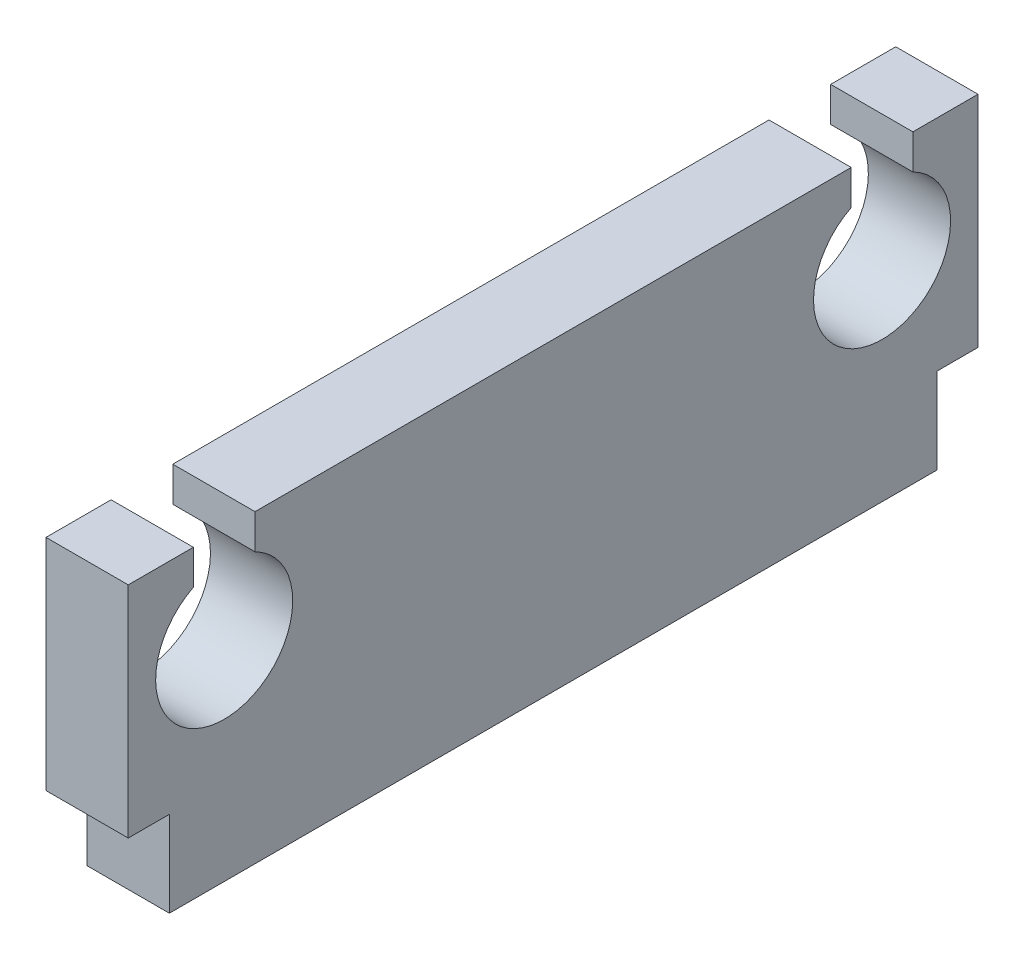
ISO-10303-21;
HEADER;
FILE_DESCRIPTION(('STEP AP214'),'2;1');
FILE_NAME('part.step','',(''),(''),'','','');
FILE_SCHEMA(('AUTOMOTIVE_DESIGN { 1 0 10303 214 1 1 1 1 }'));
ENDSEC;
DATA;
#1=APPLICATION_CONTEXT('core data for automotive mechanical design processes');
#2=APPLICATION_PROTOCOL_DEFINITION('international standard','automotive_design',2000,#1);
#3=PRODUCT_CONTEXT('',#1,'mechanical');
#4=PRODUCT('Part','Part','',(#3));
#5=PRODUCT_RELATED_PRODUCT_CATEGORY('part','',(#4));
#6=PRODUCT_DEFINITION_FORMATION('','',#4);
#7=PRODUCT_DEFINITION_CONTEXT('part definition',#1,'design');
#8=PRODUCT_DEFINITION('design','',#6,#7);
#9=PRODUCT_DEFINITION_SHAPE('','',#8);
#10=(LENGTH_UNIT() NAMED_UNIT(*) SI_UNIT(.MILLI.,.METRE.));
#11=(NAMED_UNIT(*) PLANE_ANGLE_UNIT() SI_UNIT($,.RADIAN.));
#12=(NAMED_UNIT(*) SI_UNIT($,.STERADIAN.) SOLID_ANGLE_UNIT());
#13=UNCERTAINTY_MEASURE_WITH_UNIT(LENGTH_MEASURE(1.E-05),#10,'distance_accuracy_value','');
#14=(GEOMETRIC_REPRESENTATION_CONTEXT(3) GLOBAL_UNCERTAINTY_ASSIGNED_CONTEXT((#13)) GLOBAL_UNIT_ASSIGNED_CONTEXT((#10,
#11,#12)) REPRESENTATION_CONTEXT('',''));
#15=CARTESIAN_POINT('',(0.,0.,0.));
#16=DIRECTION('',(0.,0.,1.));
#17=DIRECTION('',(1.,0.,0.));
#18=AXIS2_PLACEMENT_3D('',#15,#16,#17);
#19=CARTESIAN_POINT('',(0.,22.25,0.));
#20=DIRECTION('',(0.,-1.,0.));
#21=DIRECTION('',(0.,0.,-1.));
#22=AXIS2_PLACEMENT_3D('',#19,#20,#21);
#23=PLANE('',#22);
#24=DIRECTION('',(0.,0.,1.));
#25=VECTOR('',#24,1.);
#26=CARTESIAN_POINT('',(0.,22.25,0.));
#27=LINE('',#26,#25);
#28=CARTESIAN_POINT('',(0.,22.25,-59.));
#29=VERTEX_POINT('',#28);
#30=CARTESIAN_POINT('',(0.,22.25,-54.25));
#31=VERTEX_POINT('',#30);
#32=EDGE_CURVE('E270',#29,#31,#27,.T.);
#33=ORIENTED_EDGE('',*,*,#32,.T.);
#34=DIRECTION('',(1.,0.,0.));
#35=VECTOR('',#34,1.);
#36=CARTESIAN_POINT('',(0.,22.25,-54.25));
#37=LINE('',#36,#35);
#38=CARTESIAN_POINT('',(5.99999999999999,22.25,-54.25));
#39=VERTEX_POINT('',#38);
#40=EDGE_CURVE('E11',#31,#39,#37,.T.);
#41=ORIENTED_EDGE('',*,*,#40,.T.);
#42=DIRECTION('',(0.,0.,-1.));
#43=VECTOR('',#42,1.);
#44=CARTESIAN_POINT('',(6.,22.25,0.));
#45=LINE('',#44,#43);
#46=CARTESIAN_POINT('',(5.99999999999999,22.25,-59.));
#47=VERTEX_POINT('',#46);
#48=EDGE_CURVE('E274',#39,#47,#45,.T.);
#49=ORIENTED_EDGE('',*,*,#48,.T.);
#50=DIRECTION('',(1.,0.,0.));
#51=VECTOR('',#50,1.);
#52=CARTESIAN_POINT('',(5.99999999999999,22.25,-59.));
#53=LINE('',#52,#51);
#54=EDGE_CURVE('E254',#29,#47,#53,.T.);
#55=ORIENTED_EDGE('',*,*,#54,.F.);
#56=EDGE_LOOP('',(#33,#41,#49,#55));
#57=FACE_BOUND('',#56,.T.);
#58=ADVANCED_FACE('F43',(#57),#23,.F.);
#59=CARTESIAN_POINT('',(6.,22.25,-6.25));
#60=VERTEX_POINT('',#59);
#61=CARTESIAN_POINT('',(5.99999999999999,22.25,-49.75));
#62=VERTEX_POINT('',#61);
#63=EDGE_CURVE('E281',#60,#62,#45,.T.);
#64=ORIENTED_EDGE('',*,*,#63,.T.);
#65=DIRECTION('',(-1.,0.,0.));
#66=VECTOR('',#65,1.);
#67=CARTESIAN_POINT('',(0.,22.25,-49.75));
#68=LINE('',#67,#66);
#69=CARTESIAN_POINT('',(0.,22.25,-49.75));
#70=VERTEX_POINT('',#69);
#71=EDGE_CURVE('E52',#62,#70,#68,.T.);
#72=ORIENTED_EDGE('',*,*,#71,.T.);
#73=CARTESIAN_POINT('',(0.,22.25,-6.25));
#74=VERTEX_POINT('',#73);
#75=EDGE_CURVE('E179',#70,#74,#27,.T.);
#76=ORIENTED_EDGE('',*,*,#75,.T.);
#77=DIRECTION('',(1.,0.,0.));
#78=VECTOR('',#77,1.);
#79=CARTESIAN_POINT('',(0.,22.25,-6.25));
#80=LINE('',#79,#78);
#81=EDGE_CURVE('E311',#74,#60,#80,.T.);
#82=ORIENTED_EDGE('',*,*,#81,.T.);
#83=EDGE_LOOP('',(#64,#72,#76,#82));
#84=FACE_BOUND('',#83,.T.);
#85=ADVANCED_FACE('F317',(#84),#23,.F.);
#86=CARTESIAN_POINT('',(0.,22.25,-56.));
#87=DIRECTION('',(0.,0.,1.));
#88=DIRECTION('',(1.,0.,0.));
#89=AXIS2_PLACEMENT_3D('',#86,#87,#88);
#90=PLANE('',#89);
#91=DIRECTION('',(-1.,0.,0.));
#92=VECTOR('',#91,1.);
#93=CARTESIAN_POINT('',(5.99999999999999,6.25,-56.));
#94=LINE('',#93,#92);
#95=CARTESIAN_POINT('',(5.99999999999999,6.25,-56.));
#96=VERTEX_POINT('',#95);
#97=CARTESIAN_POINT('',(0.,6.25,-56.));
#98=VERTEX_POINT('',#97);
#99=EDGE_CURVE('E242',#96,#98,#94,.T.);
#100=ORIENTED_EDGE('',*,*,#99,.F.);
#101=DIRECTION('',(0.,-1.,0.));
#102=VECTOR('',#101,1.);
#103=CARTESIAN_POINT('',(5.99999999999999,22.25,-56.));
#104=LINE('',#103,#102);
#105=CARTESIAN_POINT('',(5.99999999999999,0.,-56.));
#106=VERTEX_POINT('',#105);
#107=EDGE_CURVE('E299',#96,#106,#104,.T.);
#108=ORIENTED_EDGE('',*,*,#107,.T.);
#109=DIRECTION('',(-1.,0.,0.));
#110=VECTOR('',#109,1.);
#111=CARTESIAN_POINT('',(0.,0.,-56.));
#112=LINE('',#111,#110);
#113=CARTESIAN_POINT('',(0.,0.,-56.));
#114=VERTEX_POINT('',#113);
#115=EDGE_CURVE('E293',#106,#114,#112,.T.);
#116=ORIENTED_EDGE('',*,*,#115,.T.);
#117=DIRECTION('',(0.,-1.,0.));
#118=VECTOR('',#117,1.);
#119=CARTESIAN_POINT('',(0.,22.25,-56.));
#120=LINE('',#119,#118);
#121=EDGE_CURVE('E280',#98,#114,#120,.T.);
#122=ORIENTED_EDGE('',*,*,#121,.F.);
#123=EDGE_LOOP('',(#100,#108,#116,#122));
#124=FACE_BOUND('',#123,.T.);
#125=ADVANCED_FACE('F380',(#124),#90,.F.);
#126=CARTESIAN_POINT('',(0.,22.25,0.));
#127=DIRECTION('',(1.,0.,0.));
#128=DIRECTION('',(0.,0.,-1.));
#129=AXIS2_PLACEMENT_3D('',#126,#127,#128);
#130=PLANE('',#129);
#131=CARTESIAN_POINT('',(0.,15.25,-52.));
#132=DIRECTION('',(-1.,0.,0.));
#133=DIRECTION('',(0.,0.,1.));
#134=AXIS2_PLACEMENT_3D('',#131,#132,#133);
#135=CIRCLE('',#134,5.);
#136=CARTESIAN_POINT('',(0.,19.7151427748729,-54.25));
#137=VERTEX_POINT('',#136);
#138=CARTESIAN_POINT('',(0.,19.7151427748729,-49.75));
#139=VERTEX_POINT('',#138);
#140=EDGE_CURVE('E168',#137,#139,#135,.T.);
#141=ORIENTED_EDGE('',*,*,#140,.F.);
#142=DIRECTION('',(0.,-1.,0.));
#143=VECTOR('',#142,1.);
#144=CARTESIAN_POINT('',(0.,19.7151427748729,-54.25));
#145=LINE('',#144,#143);
#146=EDGE_CURVE('E164',#31,#137,#145,.T.);
#147=ORIENTED_EDGE('',*,*,#146,.F.);
#148=ORIENTED_EDGE('',*,*,#32,.F.);
#149=DIRECTION('',(0.,1.,0.));
#150=VECTOR('',#149,1.);
#151=CARTESIAN_POINT('',(0.,22.25,-59.));
#152=LINE('',#151,#150);
#153=CARTESIAN_POINT('',(0.,6.25,-59.));
#154=VERTEX_POINT('',#153);
#155=EDGE_CURVE('E250',#154,#29,#152,.T.);
#156=ORIENTED_EDGE('',*,*,#155,.F.);
#157=DIRECTION('',(0.,0.,1.));
#158=VECTOR('',#157,1.);
#159=CARTESIAN_POINT('',(0.,6.25,-59.));
#160=LINE('',#159,#158);
#161=EDGE_CURVE('E258',#154,#98,#160,.T.);
#162=ORIENTED_EDGE('',*,*,#161,.T.);
#163=ORIENTED_EDGE('',*,*,#121,.T.);
#164=DIRECTION('',(0.,0.,1.));
#165=VECTOR('',#164,1.);
#166=CARTESIAN_POINT('',(0.,0.,0.));
#167=LINE('',#166,#165);
#168=CARTESIAN_POINT('',(0.,0.,0.));
#169=VERTEX_POINT('',#168);
#170=EDGE_CURVE('E269',#114,#169,#167,.T.);
#171=ORIENTED_EDGE('',*,*,#170,.T.);
#172=DIRECTION('',(0.,-1.,0.));
#173=VECTOR('',#172,1.);
#174=CARTESIAN_POINT('',(0.,22.25,0.));
#175=LINE('',#174,#173);
#176=CARTESIAN_POINT('',(0.,6.25,0.));
#177=VERTEX_POINT('',#176);
#178=EDGE_CURVE('E305',#177,#169,#175,.T.);
#179=ORIENTED_EDGE('',*,*,#178,.F.);
#180=DIRECTION('',(0.,0.,-1.));
#181=VECTOR('',#180,1.);
#182=CARTESIAN_POINT('',(0.,6.25,3.));
#183=LINE('',#182,#181);
#184=CARTESIAN_POINT('',(0.,6.25,3.));
#185=VERTEX_POINT('',#184);
#186=EDGE_CURVE('E239',#185,#177,#183,.T.);
#187=ORIENTED_EDGE('',*,*,#186,.F.);
#188=DIRECTION('',(0.,1.,0.));
#189=VECTOR('',#188,1.);
#190=CARTESIAN_POINT('',(0.,22.25,3.));
#191=LINE('',#190,#189);
#192=CARTESIAN_POINT('',(0.,22.25,3.));
#193=VERTEX_POINT('',#192);
#194=EDGE_CURVE('E225',#185,#193,#191,.T.);
#195=ORIENTED_EDGE('',*,*,#194,.T.);
#196=CARTESIAN_POINT('',(0.,22.25,-1.74999999999999));
#197=VERTEX_POINT('',#196);
#198=EDGE_CURVE('E275',#197,#193,#27,.T.);
#199=ORIENTED_EDGE('',*,*,#198,.F.);
#200=DIRECTION('',(0.,1.,0.));
#201=VECTOR('',#200,1.);
#202=CARTESIAN_POINT('',(0.,19.7151427748729,-1.74999999999999));
#203=LINE('',#202,#201);
#204=CARTESIAN_POINT('',(0.,19.7151427748729,-1.74999999999999));
#205=VERTEX_POINT('',#204);
#206=EDGE_CURVE('E59',#205,#197,#203,.T.);
#207=ORIENTED_EDGE('',*,*,#206,.F.);
#208=CARTESIAN_POINT('',(0.,15.25,-4.));
#209=DIRECTION('',(-1.,0.,0.));
#210=DIRECTION('',(0.,0.,-1.));
#211=AXIS2_PLACEMENT_3D('',#208,#209,#210);
#212=CIRCLE('',#211,5.);
#213=CARTESIAN_POINT('',(0.,19.7151427748729,-6.25));
#214=VERTEX_POINT('',#213);
#215=EDGE_CURVE('E174',#214,#205,#212,.T.);
#216=ORIENTED_EDGE('',*,*,#215,.F.);
#217=DIRECTION('',(0.,-1.,0.));
#218=VECTOR('',#217,1.);
#219=CARTESIAN_POINT('',(0.,19.7151427748729,-6.25));
#220=LINE('',#219,#218);
#221=EDGE_CURVE('E200',#74,#214,#220,.T.);
#222=ORIENTED_EDGE('',*,*,#221,.F.);
#223=ORIENTED_EDGE('',*,*,#75,.F.);
#224=DIRECTION('',(0.,1.,0.));
#225=VECTOR('',#224,1.);
#226=CARTESIAN_POINT('',(0.,19.7151427748729,-49.75));
#227=LINE('',#226,#225);
#228=EDGE_CURVE('E67',#139,#70,#227,.T.);
#229=ORIENTED_EDGE('',*,*,#228,.F.);
#230=EDGE_LOOP('',(#141,#147,#148,#156,#162,#163,#171,#179,#187,#195,#199,#207,#216,#222,#223,#229));
#231=FACE_BOUND('',#230,.T.);
#232=ADVANCED_FACE('F45',(#231),#130,.F.);
#233=CARTESIAN_POINT('',(0.,22.25,0.));
#234=DIRECTION('',(0.,0.,-1.));
#235=DIRECTION('',(-1.,0.,0.));
#236=AXIS2_PLACEMENT_3D('',#233,#234,#235);
#237=PLANE('',#236);
#238=DIRECTION('',(0.,-1.,0.));
#239=VECTOR('',#238,1.);
#240=CARTESIAN_POINT('',(6.,22.25,0.));
#241=LINE('',#240,#239);
#242=CARTESIAN_POINT('',(5.99999999999999,6.25,0.));
#243=VERTEX_POINT('',#242);
#244=CARTESIAN_POINT('',(6.,0.,0.));
#245=VERTEX_POINT('',#244);
#246=EDGE_CURVE('E302',#243,#245,#241,.T.);
#247=ORIENTED_EDGE('',*,*,#246,.F.);
#248=DIRECTION('',(-1.,0.,0.));
#249=VECTOR('',#248,1.);
#250=CARTESIAN_POINT('',(5.99999999999999,6.25,0.));
#251=LINE('',#250,#249);
#252=EDGE_CURVE('E191',#243,#177,#251,.T.);
#253=ORIENTED_EDGE('',*,*,#252,.T.);
#254=ORIENTED_EDGE('',*,*,#178,.T.);
#255=DIRECTION('',(1.,0.,0.));
#256=VECTOR('',#255,1.);
#257=CARTESIAN_POINT('',(0.,0.,0.));
#258=LINE('',#257,#256);
#259=EDGE_CURVE('E285',#169,#245,#258,.T.);
#260=ORIENTED_EDGE('',*,*,#259,.T.);
#261=EDGE_LOOP('',(#247,#253,#254,#260));
#262=FACE_BOUND('',#261,.T.);
#263=ADVANCED_FACE('F352',(#262),#237,.F.);
#264=CARTESIAN_POINT('',(6.,22.25,0.));
#265=DIRECTION('',(-1.,0.,0.));
#266=DIRECTION('',(0.,0.,1.));
#267=AXIS2_PLACEMENT_3D('',#264,#265,#266);
#268=PLANE('',#267);
#269=ORIENTED_EDGE('',*,*,#48,.F.);
#270=DIRECTION('',(0.,1.,0.));
#271=VECTOR('',#270,1.);
#272=CARTESIAN_POINT('',(5.99999999999999,19.7151427748729,-54.25));
#273=LINE('',#272,#271);
#274=CARTESIAN_POINT('',(5.99999999999999,19.7151427748729,-54.25));
#275=VERTEX_POINT('',#274);
#276=EDGE_CURVE('E187',#275,#39,#273,.T.);
#277=ORIENTED_EDGE('',*,*,#276,.F.);
#278=CARTESIAN_POINT('',(5.99999999999999,15.25,-52.));
#279=DIRECTION('',(-1.,0.,0.));
#280=DIRECTION('',(0.,0.,1.));
#281=AXIS2_PLACEMENT_3D('',#278,#279,#280);
#282=CIRCLE('',#281,5.);
#283=CARTESIAN_POINT('',(5.99999999999999,19.7151427748729,-49.75));
#284=VERTEX_POINT('',#283);
#285=EDGE_CURVE('E192',#284,#275,#282,.F.);
#286=ORIENTED_EDGE('',*,*,#285,.F.);
#287=DIRECTION('',(0.,-1.,0.));
#288=VECTOR('',#287,1.);
#289=CARTESIAN_POINT('',(5.99999999999999,19.7151427748729,-49.75));
#290=LINE('',#289,#288);
#291=EDGE_CURVE('E159',#62,#284,#290,.T.);
#292=ORIENTED_EDGE('',*,*,#291,.F.);
#293=ORIENTED_EDGE('',*,*,#63,.F.);
#294=DIRECTION('',(0.,1.,0.));
#295=VECTOR('',#294,1.);
#296=CARTESIAN_POINT('',(6.,19.7151427748729,-6.25));
#297=LINE('',#296,#295);
#298=CARTESIAN_POINT('',(6.,19.7151427748729,-6.25));
#299=VERTEX_POINT('',#298);
#300=EDGE_CURVE('E205',#299,#60,#297,.T.);
#301=ORIENTED_EDGE('',*,*,#300,.F.);
#302=CARTESIAN_POINT('',(6.,15.25,-4.));
#303=DIRECTION('',(-1.,0.,0.));
#304=DIRECTION('',(0.,0.,1.));
#305=AXIS2_PLACEMENT_3D('',#302,#303,#304);
#306=CIRCLE('',#305,5.);
#307=CARTESIAN_POINT('',(6.,19.7151427748729,-1.75));
#308=VERTEX_POINT('',#307);
#309=EDGE_CURVE('E196',#308,#299,#306,.F.);
#310=ORIENTED_EDGE('',*,*,#309,.F.);
#311=DIRECTION('',(0.,-1.,0.));
#312=VECTOR('',#311,1.);
#313=CARTESIAN_POINT('',(6.,19.7151427748729,-1.75));
#314=LINE('',#313,#312);
#315=CARTESIAN_POINT('',(6.,22.25,-1.75));
#316=VERTEX_POINT('',#315);
#317=EDGE_CURVE('E193',#316,#308,#314,.T.);
#318=ORIENTED_EDGE('',*,*,#317,.F.);
#319=CARTESIAN_POINT('',(5.99999999999999,22.25,3.));
#320=VERTEX_POINT('',#319);
#321=EDGE_CURVE('E276',#320,#316,#45,.T.);
#322=ORIENTED_EDGE('',*,*,#321,.F.);
#323=DIRECTION('',(0.,-1.,0.));
#324=VECTOR('',#323,1.);
#325=CARTESIAN_POINT('',(5.99999999999999,22.25,3.));
#326=LINE('',#325,#324);
#327=CARTESIAN_POINT('',(5.99999999999999,6.25,3.));
#328=VERTEX_POINT('',#327);
#329=EDGE_CURVE('E217',#320,#328,#326,.T.);
#330=ORIENTED_EDGE('',*,*,#329,.T.);
#331=DIRECTION('',(0.,0.,-1.));
#332=VECTOR('',#331,1.);
#333=CARTESIAN_POINT('',(5.99999999999999,6.25,3.));
#334=LINE('',#333,#332);
#335=EDGE_CURVE('E233',#328,#243,#334,.T.);
#336=ORIENTED_EDGE('',*,*,#335,.T.);
#337=ORIENTED_EDGE('',*,*,#246,.T.);
#338=DIRECTION('',(0.,0.,-1.));
#339=VECTOR('',#338,1.);
#340=CARTESIAN_POINT('',(6.,0.,0.));
#341=LINE('',#340,#339);
#342=EDGE_CURVE('E289',#245,#106,#341,.T.);
#343=ORIENTED_EDGE('',*,*,#342,.T.);
#344=ORIENTED_EDGE('',*,*,#107,.F.);
#345=DIRECTION('',(0.,0.,1.));
#346=VECTOR('',#345,1.);
#347=CARTESIAN_POINT('',(5.99999999999999,6.25,-59.));
#348=LINE('',#347,#346);
#349=CARTESIAN_POINT('',(5.99999999999999,6.25,-59.));
#350=VERTEX_POINT('',#349);
#351=EDGE_CURVE('E265',#350,#96,#348,.T.);
#352=ORIENTED_EDGE('',*,*,#351,.F.);
#353=DIRECTION('',(0.,-1.,0.));
#354=VECTOR('',#353,1.);
#355=CARTESIAN_POINT('',(5.99999999999999,22.25,-59.));
#356=LINE('',#355,#354);
#357=EDGE_CURVE('E243',#47,#350,#356,.T.);
#358=ORIENTED_EDGE('',*,*,#357,.F.);
#359=EDGE_LOOP('',(#269,#277,#286,#292,#293,#301,#310,#318,#322,#330,#336,#337,#343,#344,#352,#358));
#360=FACE_BOUND('',#359,.T.);
#361=ADVANCED_FACE('F321',(#360),#268,.F.);
#362=ORIENTED_EDGE('',*,*,#321,.T.);
#363=DIRECTION('',(-1.,0.,0.));
#364=VECTOR('',#363,1.);
#365=CARTESIAN_POINT('',(0.,22.25,-1.74999999999999));
#366=LINE('',#365,#364);
#367=EDGE_CURVE('E308',#316,#197,#366,.T.);
#368=ORIENTED_EDGE('',*,*,#367,.T.);
#369=ORIENTED_EDGE('',*,*,#198,.T.);
#370=DIRECTION('',(1.,0.,0.));
#371=VECTOR('',#370,1.);
#372=CARTESIAN_POINT('',(5.99999999999999,22.25,3.));
#373=LINE('',#372,#371);
#374=EDGE_CURVE('E221',#193,#320,#373,.T.);
#375=ORIENTED_EDGE('',*,*,#374,.T.);
#376=EDGE_LOOP('',(#362,#368,#369,#375));
#377=FACE_BOUND('',#376,.T.);
#378=ADVANCED_FACE('F340',(#377),#23,.F.);
#379=CARTESIAN_POINT('',(0.,0.,0.));
#380=DIRECTION('',(0.,-1.,0.));
#381=DIRECTION('',(0.,0.,-1.));
#382=AXIS2_PLACEMENT_3D('',#379,#380,#381);
#383=PLANE('',#382);
#384=ORIENTED_EDGE('',*,*,#170,.F.);
#385=ORIENTED_EDGE('',*,*,#115,.F.);
#386=ORIENTED_EDGE('',*,*,#342,.F.);
#387=ORIENTED_EDGE('',*,*,#259,.F.);
#388=EDGE_LOOP('',(#384,#385,#386,#387));
#389=FACE_BOUND('',#388,.T.);
#390=ADVANCED_FACE('F384',(#389),#383,.T.);
#391=CARTESIAN_POINT('',(5.99999999999999,6.25,-59.));
#392=DIRECTION('',(0.,1.,0.));
#393=DIRECTION('',(0.,0.,1.));
#394=AXIS2_PLACEMENT_3D('',#391,#392,#393);
#395=PLANE('',#394);
#396=ORIENTED_EDGE('',*,*,#99,.T.);
#397=ORIENTED_EDGE('',*,*,#161,.F.);
#398=DIRECTION('',(-1.,0.,0.));
#399=VECTOR('',#398,1.);
#400=CARTESIAN_POINT('',(5.99999999999999,6.25,-59.));
#401=LINE('',#400,#399);
#402=EDGE_CURVE('E247',#350,#154,#401,.T.);
#403=ORIENTED_EDGE('',*,*,#402,.F.);
#404=ORIENTED_EDGE('',*,*,#351,.T.);
#405=EDGE_LOOP('',(#396,#397,#403,#404));
#406=FACE_BOUND('',#405,.T.);
#407=ADVANCED_FACE('F389',(#406),#395,.F.);
#408=CARTESIAN_POINT('',(0.,0.,-59.));
#409=DIRECTION('',(0.,0.,-1.));
#410=DIRECTION('',(-1.,0.,0.));
#411=AXIS2_PLACEMENT_3D('',#408,#409,#410);
#412=PLANE('',#411);
#413=ORIENTED_EDGE('',*,*,#357,.T.);
#414=ORIENTED_EDGE('',*,*,#402,.T.);
#415=ORIENTED_EDGE('',*,*,#155,.T.);
#416=ORIENTED_EDGE('',*,*,#54,.T.);
#417=EDGE_LOOP('',(#413,#414,#415,#416));
#418=FACE_BOUND('',#417,.T.);
#419=ADVANCED_FACE('F405',(#418),#412,.T.);
#420=CARTESIAN_POINT('',(5.99999999999999,6.25,3.));
#421=DIRECTION('',(0.,-1.,0.));
#422=DIRECTION('',(0.,0.,-1.));
#423=AXIS2_PLACEMENT_3D('',#420,#421,#422);
#424=PLANE('',#423);
#425=ORIENTED_EDGE('',*,*,#252,.F.);
#426=ORIENTED_EDGE('',*,*,#335,.F.);
#427=DIRECTION('',(-1.,0.,0.));
#428=VECTOR('',#427,1.);
#429=CARTESIAN_POINT('',(5.99999999999999,6.25,3.));
#430=LINE('',#429,#428);
#431=EDGE_CURVE('E229',#328,#185,#430,.T.);
#432=ORIENTED_EDGE('',*,*,#431,.T.);
#433=ORIENTED_EDGE('',*,*,#186,.T.);
#434=EDGE_LOOP('',(#425,#426,#432,#433));
#435=FACE_BOUND('',#434,.T.);
#436=ADVANCED_FACE('F349',(#435),#424,.T.);
#437=CARTESIAN_POINT('',(0.,0.,3.));
#438=DIRECTION('',(0.,0.,1.));
#439=DIRECTION('',(-1.,0.,0.));
#440=AXIS2_PLACEMENT_3D('',#437,#438,#439);
#441=PLANE('',#440);
#442=ORIENTED_EDGE('',*,*,#329,.F.);
#443=ORIENTED_EDGE('',*,*,#374,.F.);
#444=ORIENTED_EDGE('',*,*,#194,.F.);
#445=ORIENTED_EDGE('',*,*,#431,.F.);
#446=EDGE_LOOP('',(#442,#443,#444,#445));
#447=FACE_BOUND('',#446,.T.);
#448=ADVANCED_FACE('F344',(#447),#441,.T.);
#449=CARTESIAN_POINT('',(23.5852311755478,19.7151427748729,-6.25));
#450=DIRECTION('',(0.,0.,-1.));
#451=DIRECTION('',(-1.,0.,0.));
#452=AXIS2_PLACEMENT_3D('',#449,#450,#451);
#453=PLANE('',#452);
#454=ORIENTED_EDGE('',*,*,#221,.T.);
#455=DIRECTION('',(-1.,0.,0.));
#456=VECTOR('',#455,1.);
#457=CARTESIAN_POINT('',(23.5852311755478,19.7151427748729,-6.25));
#458=LINE('',#457,#456);
#459=EDGE_CURVE('E201',#299,#214,#458,.T.);
#460=ORIENTED_EDGE('',*,*,#459,.F.);
#461=ORIENTED_EDGE('',*,*,#300,.T.);
#462=ORIENTED_EDGE('',*,*,#81,.F.);
#463=EDGE_LOOP('',(#454,#460,#461,#462));
#464=FACE_BOUND('',#463,.T.);
#465=ADVANCED_FACE('F366',(#464),#453,.F.);
#466=CARTESIAN_POINT('',(23.5852311755478,19.7151427748729,-1.75));
#467=DIRECTION('',(0.,0.,1.));
#468=DIRECTION('',(1.,0.,0.));
#469=AXIS2_PLACEMENT_3D('',#466,#467,#468);
#470=PLANE('',#469);
#471=ORIENTED_EDGE('',*,*,#317,.T.);
#472=DIRECTION('',(-1.,0.,0.));
#473=VECTOR('',#472,1.);
#474=CARTESIAN_POINT('',(23.5852311755478,19.7151427748729,-1.75));
#475=LINE('',#474,#473);
#476=EDGE_CURVE('E197',#308,#205,#475,.T.);
#477=ORIENTED_EDGE('',*,*,#476,.T.);
#478=ORIENTED_EDGE('',*,*,#206,.T.);
#479=ORIENTED_EDGE('',*,*,#367,.F.);
#480=EDGE_LOOP('',(#471,#477,#478,#479));
#481=FACE_BOUND('',#480,.T.);
#482=ADVANCED_FACE('F360',(#481),#470,.F.);
#483=CARTESIAN_POINT('',(23.5852311755478,15.25,-4.));
#484=DIRECTION('',(-1.,0.,0.));
#485=DIRECTION('',(0.,0.,1.));
#486=AXIS2_PLACEMENT_3D('',#483,#484,#485);
#487=CYLINDRICAL_SURFACE('',#486,5.);
#488=ORIENTED_EDGE('',*,*,#309,.T.);
#489=ORIENTED_EDGE('',*,*,#459,.T.);
#490=ORIENTED_EDGE('',*,*,#215,.T.);
#491=ORIENTED_EDGE('',*,*,#476,.F.);
#492=EDGE_LOOP('',(#488,#489,#490,#491));
#493=FACE_BOUND('',#492,.T.);
#494=ADVANCED_FACE('F362',(#493),#487,.F.);
#495=CARTESIAN_POINT('',(23.5852311755478,19.7151427748729,-54.25));
#496=DIRECTION('',(0.,0.,-1.));
#497=DIRECTION('',(-1.,0.,0.));
#498=AXIS2_PLACEMENT_3D('',#495,#496,#497);
#499=PLANE('',#498);
#500=ORIENTED_EDGE('',*,*,#146,.T.);
#501=DIRECTION('',(-1.,0.,0.));
#502=VECTOR('',#501,1.);
#503=CARTESIAN_POINT('',(23.5852311755478,19.7151427748729,-54.25));
#504=LINE('',#503,#502);
#505=EDGE_CURVE('E163',#275,#137,#504,.T.);
#506=ORIENTED_EDGE('',*,*,#505,.F.);
#507=ORIENTED_EDGE('',*,*,#276,.T.);
#508=ORIENTED_EDGE('',*,*,#40,.F.);
#509=EDGE_LOOP('',(#500,#506,#507,#508));
#510=FACE_BOUND('',#509,.T.);
#511=ADVANCED_FACE('F328',(#510),#499,.F.);
#512=CARTESIAN_POINT('',(23.5852311755478,19.7151427748729,-49.75));
#513=DIRECTION('',(0.,0.,1.));
#514=DIRECTION('',(1.,0.,0.));
#515=AXIS2_PLACEMENT_3D('',#512,#513,#514);
#516=PLANE('',#515);
#517=ORIENTED_EDGE('',*,*,#291,.T.);
#518=DIRECTION('',(-1.,0.,0.));
#519=VECTOR('',#518,1.);
#520=CARTESIAN_POINT('',(23.5852311755478,19.7151427748729,-49.75));
#521=LINE('',#520,#519);
#522=EDGE_CURVE('E155',#284,#139,#521,.T.);
#523=ORIENTED_EDGE('',*,*,#522,.T.);
#524=ORIENTED_EDGE('',*,*,#228,.T.);
#525=ORIENTED_EDGE('',*,*,#71,.F.);
#526=EDGE_LOOP('',(#517,#523,#524,#525));
#527=FACE_BOUND('',#526,.T.);
#528=ADVANCED_FACE('F157',(#527),#516,.F.);
#529=CARTESIAN_POINT('',(23.5852311755478,15.25,-52.));
#530=DIRECTION('',(-1.,0.,0.));
#531=DIRECTION('',(0.,0.,1.));
#532=AXIS2_PLACEMENT_3D('',#529,#530,#531);
#533=CYLINDRICAL_SURFACE('',#532,5.);
#534=ORIENTED_EDGE('',*,*,#285,.T.);
#535=ORIENTED_EDGE('',*,*,#505,.T.);
#536=ORIENTED_EDGE('',*,*,#140,.T.);
#537=ORIENTED_EDGE('',*,*,#522,.F.);
#538=EDGE_LOOP('',(#534,#535,#536,#537));
#539=FACE_BOUND('',#538,.T.);
#540=ADVANCED_FACE('F169',(#539),#533,.F.);
#541=CLOSED_SHELL('',(#58,#85,#125,#232,#263,#361,#378,#390,#407,#419,#436,#448,#465,#482,#494,
#511,#528,#540));
#542=MANIFOLD_SOLID_BREP('B2',#541);
#543=ADVANCED_BREP_SHAPE_REPRESENTATION('',(#18,#542),#14);
#544=SHAPE_DEFINITION_REPRESENTATION(#9,#543);
ENDSEC;
END-ISO-10303-21;
